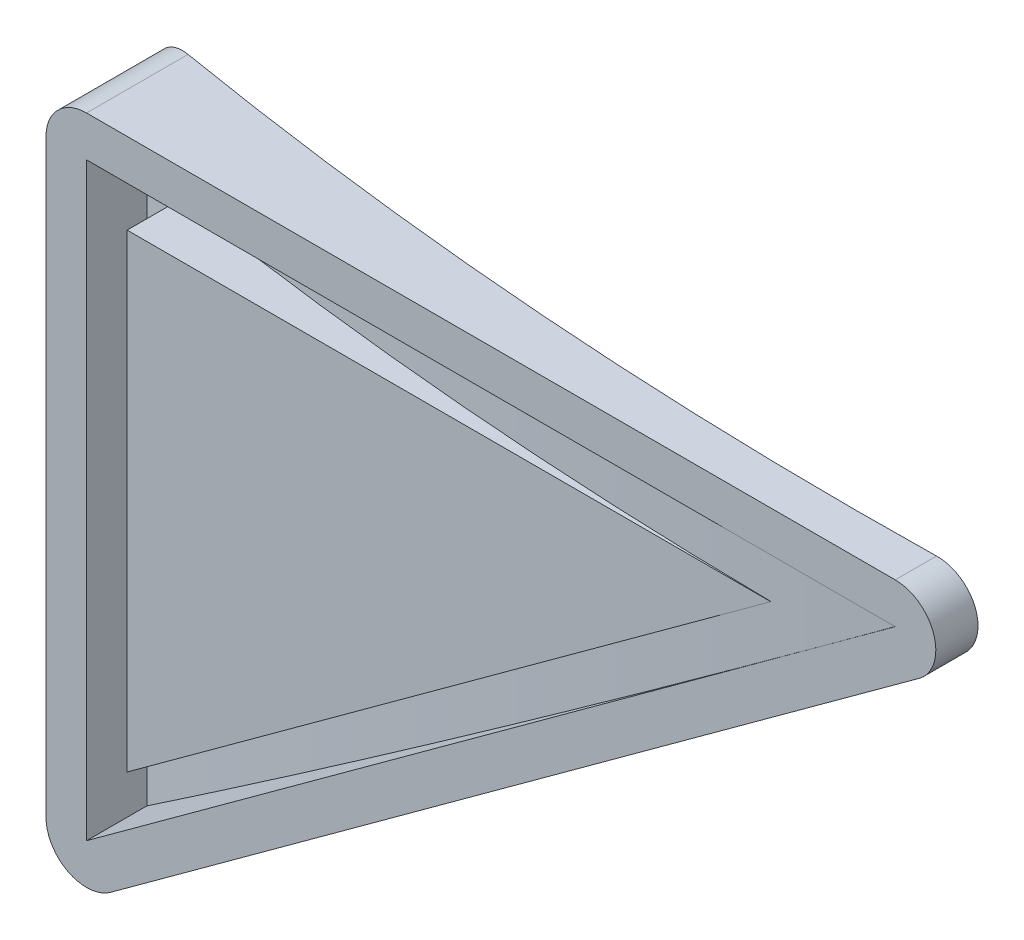
ISO-10303-21;
HEADER;
FILE_DESCRIPTION(('STEP AP214'),'2;1');
FILE_NAME('part.step','',(''),(''),'','','');
FILE_SCHEMA(('AUTOMOTIVE_DESIGN { 1 0 10303 214 1 1 1 1 }'));
ENDSEC;
DATA;
#1=APPLICATION_CONTEXT('core data for automotive mechanical design processes');
#2=APPLICATION_PROTOCOL_DEFINITION('international standard','automotive_design',2000,#1);
#3=PRODUCT_CONTEXT('',#1,'mechanical');
#4=PRODUCT('Part','Part','',(#3));
#5=PRODUCT_RELATED_PRODUCT_CATEGORY('part','',(#4));
#6=PRODUCT_DEFINITION_FORMATION('','',#4);
#7=PRODUCT_DEFINITION_CONTEXT('part definition',#1,'design');
#8=PRODUCT_DEFINITION('design','',#6,#7);
#9=PRODUCT_DEFINITION_SHAPE('','',#8);
#10=(LENGTH_UNIT() NAMED_UNIT(*) SI_UNIT(.MILLI.,.METRE.));
#11=(NAMED_UNIT(*) PLANE_ANGLE_UNIT() SI_UNIT($,.RADIAN.));
#12=(NAMED_UNIT(*) SI_UNIT($,.STERADIAN.) SOLID_ANGLE_UNIT());
#13=UNCERTAINTY_MEASURE_WITH_UNIT(LENGTH_MEASURE(1.E-05),#10,'distance_accuracy_value','');
#14=(GEOMETRIC_REPRESENTATION_CONTEXT(3) GLOBAL_UNCERTAINTY_ASSIGNED_CONTEXT((#13)) GLOBAL_UNIT_ASSIGNED_CONTEXT((#10,
#11,#12)) REPRESENTATION_CONTEXT('',''));
#15=CARTESIAN_POINT('',(0.,0.,0.));
#16=DIRECTION('',(0.,0.,1.));
#17=DIRECTION('',(1.,0.,0.));
#18=AXIS2_PLACEMENT_3D('',#15,#16,#17);
#19=CARTESIAN_POINT('',(0.,175.,0.));
#20=DIRECTION('',(0.,-1.,0.));
#21=DIRECTION('',(0.,0.,-1.));
#22=AXIS2_PLACEMENT_3D('',#19,#20,#21);
#23=CYLINDRICAL_SURFACE('',#22,1097.);
#24=DIRECTION('',(0.,-1.,0.));
#25=VECTOR('',#24,1.);
#26=CARTESIAN_POINT('',(-170.,175.,1083.74766435734));
#27=LINE('',#26,#25);
#28=CARTESIAN_POINT('',(-170.,155.,1083.74766435734));
#29=VERTEX_POINT('',#28);
#30=CARTESIAN_POINT('',(-170.,39.3355779004651,1083.74766435734));
#31=VERTEX_POINT('',#30);
#32=EDGE_CURVE('E57',#29,#31,#27,.T.);
#33=ORIENTED_EDGE('',*,*,#32,.F.);
#34=CARTESIAN_POINT('',(0.,155.,0.));
#35=DIRECTION('',(0.,1.,0.));
#36=DIRECTION('',(0.,0.,1.));
#37=AXIS2_PLACEMENT_3D('',#34,#35,#36);
#38=CIRCLE('',#37,1097.);
#39=CARTESIAN_POINT('',(-11.3745068349236,155.,1096.94102876785));
#40=VERTEX_POINT('',#39);
#41=EDGE_CURVE('E170',#40,#29,#38,.F.);
#42=ORIENTED_EDGE('',*,*,#41,.F.);
#43=CARTESIAN_POINT('',(0.,163.293911233798,0.));
#44=DIRECTION('',(0.589172157449442,-0.808007530216378,0.));
#45=DIRECTION('',(-0.808007530216378,-0.589172157449442,0.));
#46=AXIS2_PLACEMENT_3D('',#43,#44,#45);
#47=ELLIPSE('',#46,1357.66061450718,1097.);
#48=EDGE_CURVE('E144',#31,#40,#47,.F.);
#49=ORIENTED_EDGE('',*,*,#48,.F.);
#50=EDGE_LOOP('',(#33,#42,#49));
#51=FACE_BOUND('',#50,.T.);
#52=CARTESIAN_POINT('',(0.,165.,0.));
#53=DIRECTION('',(0.,1.,0.));
#54=DIRECTION('',(0.,0.,1.));
#55=AXIS2_PLACEMENT_3D('',#52,#53,#54);
#56=CIRCLE('',#55,1097.);
#57=CARTESIAN_POINT('',(19.3127465825383,165.,1096.82998583164));
#58=VERTEX_POINT('',#57);
#59=CARTESIAN_POINT('',(0.,165.,1097.));
#60=VERTEX_POINT('',#59);
#61=EDGE_CURVE('E184',#58,#60,#56,.F.);
#62=ORIENTED_EDGE('',*,*,#61,.T.);
#63=CARTESIAN_POINT('',(0.,165.,0.));
#64=DIRECTION('',(0.,1.,0.));
#65=DIRECTION('',(0.,0.,1.));
#66=AXIS2_PLACEMENT_3D('',#63,#64,#65);
#67=CIRCLE('',#66,1097.);
#68=CARTESIAN_POINT('',(-180.,165.,1082.13169254024));
#69=VERTEX_POINT('',#68);
#70=EDGE_CURVE('E65',#60,#69,#67,.F.);
#71=ORIENTED_EDGE('',*,*,#70,.T.);
#72=DIRECTION('',(0.,-1.,0.));
#73=VECTOR('',#72,1.);
#74=CARTESIAN_POINT('',(-180.,175.,1082.13169254024));
#75=LINE('',#74,#73);
#76=CARTESIAN_POINT('',(-180.,19.6677889502324,1082.13169254024));
#77=VERTEX_POINT('',#76);
#78=EDGE_CURVE('E197',#69,#77,#75,.T.);
#79=ORIENTED_EDGE('',*,*,#78,.T.);
#80=CARTESIAN_POINT('',(0.,150.917788950233,0.));
#81=DIRECTION('',(0.589172157449442,-0.808007530216378,0.));
#82=DIRECTION('',(-0.808007530216378,-0.589172157449442,0.));
#83=AXIS2_PLACEMENT_3D('',#80,#81,#82);
#84=ELLIPSE('',#83,1357.66061450719,1097.);
#85=CARTESIAN_POINT('',(0.,150.917788950233,1097.));
#86=VERTEX_POINT('',#85);
#87=EDGE_CURVE('E200',#77,#86,#84,.F.);
#88=ORIENTED_EDGE('',*,*,#87,.T.);
#89=CARTESIAN_POINT('',(0.,150.917788950233,0.));
#90=DIRECTION('',(0.589172157449442,-0.808007530216378,0.));
#91=DIRECTION('',(-0.808007530216378,-0.589172157449442,0.));
#92=AXIS2_PLACEMENT_3D('',#89,#90,#91);
#93=ELLIPSE('',#92,1357.66061450719,1097.);
#94=EDGE_CURVE('E180',#86,#58,#93,.F.);
#95=ORIENTED_EDGE('',*,*,#94,.T.);
#96=EDGE_LOOP('',(#62,#71,#79,#88,#95));
#97=FACE_BOUND('',#96,.T.);
#98=ADVANCED_FACE('F40',(#51,#97),#23,.T.);
#99=CARTESIAN_POINT('',(0.,175.,0.));
#100=DIRECTION('',(0.,-1.,0.));
#101=DIRECTION('',(0.,0.,-1.));
#102=AXIS2_PLACEMENT_3D('',#99,#100,#101);
#103=CYLINDRICAL_SURFACE('',#102,1087.);
#104=CARTESIAN_POINT('',(0.,138.541666666667,0.));
#105=DIRECTION('',(-0.589172157449442,0.808007530216377,0.));
#106=DIRECTION('',(-0.808007530216378,-0.589172157449442,0.));
#107=AXIS2_PLACEMENT_3D('',#104,#105,#106);
#108=ELLIPSE('',#107,1345.28449222362,1087.);
#109=CARTESIAN_POINT('',(25.2044681570327,156.919924697836,1086.70775040253));
#110=VERTEX_POINT('',#109);
#111=CARTESIAN_POINT('',(-174.108278425506,11.5877136480688,1072.96565992752));
#112=VERTEX_POINT('',#111);
#113=EDGE_CURVE('E204',#110,#112,#108,.F.);
#114=ORIENTED_EDGE('',*,*,#113,.T.);
#115=CARTESIAN_POINT('',(-174.108278425505,11.5877136480688,1072.96565992752));
#116=CARTESIAN_POINT('',(-174.338273746473,11.4199715353943,1072.92833964947));
#117=CARTESIAN_POINT('',(-174.575326334058,11.2621996459547,1072.88979701747));
#118=CARTESIAN_POINT('',(-175.061709157857,10.967561505856,1072.81054166278));
#119=CARTESIAN_POINT('',(-175.31103812756,10.8306931046086,1072.76982916393));
#120=CARTESIAN_POINT('',(-175.819932342061,10.5789171737396,1072.68654223683));
#121=CARTESIAN_POINT('',(-176.079487184804,10.4639879889427,1072.6439696961));
#122=CARTESIAN_POINT('',(-176.607186332997,10.2566696655293,1072.55721208685));
#123=CARTESIAN_POINT('',(-176.875330669272,10.1642806078132,1072.51302701253));
#124=CARTESIAN_POINT('',(-177.418338999365,10.0026303031811,1072.42333466181));
#125=CARTESIAN_POINT('',(-177.693204193145,9.9333732191569,1072.37782714901));
#126=CARTESIAN_POINT('',(-178.247663848457,9.81844999165931,1072.28580579155));
#127=CARTESIAN_POINT('',(-178.527258434578,9.77278447067994,1072.23929192036));
#128=CARTESIAN_POINT('',(-179.089176978252,9.70533589213078,1072.14558144606));
#129=CARTESIAN_POINT('',(-179.371500722173,9.6835509802738,1072.09838489623));
#130=CARTESIAN_POINT('',(-179.93691805033,9.66398761150045,1072.00363231265));
#131=CARTESIAN_POINT('',(-180.22001163557,9.66620918592908,1071.95607627844));
#132=CARTESIAN_POINT('',(-180.786736922285,9.69472327609535,1071.86064338274));
#133=CARTESIAN_POINT('',(-181.070361119588,9.72116460911046,1071.81276635642));
#134=CARTESIAN_POINT('',(-181.634368040197,9.79814623188512,1071.71733127345));
#135=CARTESIAN_POINT('',(-181.914750829772,9.84868602807346,1071.66977321027));
#136=CARTESIAN_POINT('',(-182.470331605161,9.97353613739706,1071.57531583085));
#137=CARTESIAN_POINT('',(-182.745528826125,10.0478499284895,1071.52841661203));
#138=CARTESIAN_POINT('',(-183.288731810457,10.2197522385687,1071.43563349246));
#139=CARTESIAN_POINT('',(-183.556737587024,10.3173407148381,1071.38974958984));
#140=CARTESIAN_POINT('',(-184.083745140951,10.5351902588334,1071.29932618843));
#141=CARTESIAN_POINT('',(-184.342743007426,10.6554610323139,1071.25478727467));
#142=CARTESIAN_POINT('',(-184.849733582945,10.9178429671142,1071.16742023464));
#143=CARTESIAN_POINT('',(-185.097726265614,11.0599541807737,1071.12459211249));
#144=CARTESIAN_POINT('',(-185.580862504098,11.3650429523676,1071.04099061634));
#145=CARTESIAN_POINT('',(-185.81600719561,11.5280186617156,1071.00021706076));
#146=CARTESIAN_POINT('',(-186.271719525166,11.8737316156122,1070.92105217949));
#147=CARTESIAN_POINT('',(-186.492287301752,12.0564686722996,1070.88266083118));
#148=CARTESIAN_POINT('',(-186.91532575538,12.4387615790981,1070.80890298334));
#149=CARTESIAN_POINT('',(-187.117937608419,12.6381566764303,1070.77351300307));
#150=CARTESIAN_POINT('',(-187.505678604165,13.053746907084,1070.70568282766));
#151=CARTESIAN_POINT('',(-187.690807628952,13.2699421537024,1070.67324265241));
#152=CARTESIAN_POINT('',(-188.042189484985,13.7176479829785,1070.61158540756));
#153=CARTESIAN_POINT('',(-188.208439547946,13.9491608038473,1070.58236881067));
#154=CARTESIAN_POINT('',(-188.520734958871,14.4258185581858,1070.52742031165));
#155=CARTESIAN_POINT('',(-188.6667810035,14.6709630212074,1070.50168828938));
#156=CARTESIAN_POINT('',(-188.935642716397,15.16963226785,1070.45426866168));
#157=CARTESIAN_POINT('',(-189.058752530737,15.4229936272935,1070.43252990408));
#158=CARTESIAN_POINT('',(-189.283249234619,15.9394436598426,1070.39285524535));
#159=CARTESIAN_POINT('',(-189.38463693855,16.2025319678395,1070.37491920165));
#160=CARTESIAN_POINT('',(-189.564812588519,16.7362996745688,1070.34302455193));
#161=CARTESIAN_POINT('',(-189.643621267624,17.0069718570544,1070.32906229708));
#162=CARTESIAN_POINT('',(-189.778114732121,17.5540724782283,1070.3052236684));
#163=CARTESIAN_POINT('',(-189.833808540342,17.8304986265385,1070.29534570028));
#164=CARTESIAN_POINT('',(-189.91843198205,18.3666994980187,1070.2803328999));
#165=CARTESIAN_POINT('',(-189.949028242396,18.6262043491936,1070.27490275161));
#166=CARTESIAN_POINT('',(-189.989806076038,19.14640017008,1070.26766449157));
#167=CARTESIAN_POINT('',(-190.000023684464,19.4070882276713,1070.26584998638));
#168=CARTESIAN_POINT('',(-190.,19.6677889502326,1070.265854823));
#169=B_SPLINE_CURVE_WITH_KNOTS('',3,(#115,#116,#117,#118,#119,#120,#121,#122,#123,#124,#125,
#126,#127,#128,#129,#130,#131,#132,#133,#134,#135,#136,#137,#138,#139,#140,#141,#142,#143,#144,
#145,#146,#147,#148,#149,#150,#151,#152,#153,#154,#155,#156,#157,#158,#159,#160,#161,#162,#163,
#164,#165,#166,#167,#168),.UNSPECIFIED.,.F.,.F.,(4,2,2,2,2,2,2,2,2,2,2,2,2,2,2,2,2,2,2,2,2,2,2,
2,2,2,4),(0.,0.861031072831286,1.72197350147786,2.58206168954562,3.44215296456916,
4.30239894061912,5.16266761421727,6.0228694847376,6.8830724784139,7.74859666801091,
8.61410313118814,9.47973626941707,10.3453678189161,11.2113706160212,12.0773754885047,
12.9433036863191,13.8092236529093,14.6675842337775,15.5259506037615,16.3844426768274,
17.2429051404292,18.0894590898157,18.9359812953204,19.7817236767181,20.6271356135766,
21.4103946685647,22.1922674712198),.UNSPECIFIED.);
#170=CARTESIAN_POINT('',(-190.,19.6677889502326,1070.265854823));
#171=VERTEX_POINT('',#170);
#172=EDGE_CURVE('E288',#112,#171,#169,.T.);
#173=ORIENTED_EDGE('',*,*,#172,.T.);
#174=DIRECTION('',(0.,-1.,0.));
#175=VECTOR('',#174,1.);
#176=CARTESIAN_POINT('',(-190.,175.,1070.265854823));
#177=LINE('',#176,#175);
#178=CARTESIAN_POINT('',(-190.,165.,1070.265854823));
#179=VERTEX_POINT('',#178);
#180=EDGE_CURVE('E247',#171,#179,#177,.F.);
#181=ORIENTED_EDGE('',*,*,#180,.T.);
#182=CARTESIAN_POINT('',(-190.,165.,1070.265854823));
#183=CARTESIAN_POINT('',(-190.000032451494,165.27816778552,1070.26584823925));
#184=CARTESIAN_POINT('',(-189.988394792284,165.556329549505,1070.26791502348));
#185=CARTESIAN_POINT('',(-189.942014655616,166.110637537032,1070.27614758697));
#186=CARTESIAN_POINT('',(-189.907274032663,166.386783920551,1070.28231303722));
#187=CARTESIAN_POINT('',(-189.814978647041,166.934774333611,1070.29868538825));
#188=CARTESIAN_POINT('',(-189.757451279054,167.20662312319,1070.30888743613));
#189=CARTESIAN_POINT('',(-189.620038571035,167.744425968653,1070.33324057011));
#190=CARTESIAN_POINT('',(-189.540153364401,168.010380059699,1070.34739163265));
#191=CARTESIAN_POINT('',(-189.358609268536,168.53460053257,1070.37952408435));
#192=CARTESIAN_POINT('',(-189.256943796647,168.792864563289,1070.39750663148));
#193=CARTESIAN_POINT('',(-189.032625906311,169.299825970811,1070.43714402559));
#194=CARTESIAN_POINT('',(-188.909972874059,169.548523067558,1070.45879897996));
#195=CARTESIAN_POINT('',(-188.644615393255,170.034609550072,1070.50559420478));
#196=CARTESIAN_POINT('',(-188.501912438082,170.271999776248,1070.53073421564));
#197=CARTESIAN_POINT('',(-188.197509066875,170.73387689941,1070.58428974684));
#198=CARTESIAN_POINT('',(-188.035808633859,170.958363784862,1070.6127052701));
#199=CARTESIAN_POINT('',(-187.693412073324,171.394434262396,1070.6727854359));
#200=CARTESIAN_POINT('',(-187.512592192599,171.605917769624,1070.70447120951));
#201=CARTESIAN_POINT('',(-187.134212102499,172.012860587524,1070.77066804182));
#202=CARTESIAN_POINT('',(-186.936651676775,172.208319691036,1070.80517913703));
#203=CARTESIAN_POINT('',(-186.526172313728,172.581959894016,1070.87675782212));
#204=CARTESIAN_POINT('',(-186.313250185255,172.760137385378,1070.91382594311));
#205=CARTESIAN_POINT('',(-185.873598199561,173.098006467087,1070.99022183526));
#206=CARTESIAN_POINT('',(-185.646868395528,173.257698128635,1071.02954959773));
#207=CARTESIAN_POINT('',(-185.177781609363,173.559762099156,1071.1107536878));
#208=CARTESIAN_POINT('',(-184.935244763251,173.701847415619,1071.15265884708));
#209=CARTESIAN_POINT('',(-184.439317758427,173.965002261875,1071.23816277299));
#210=CARTESIAN_POINT('',(-184.185927577505,174.086071748656,1071.28176154307));
#211=CARTESIAN_POINT('',(-183.670137835811,174.306378774386,1071.37031360573));
#212=CARTESIAN_POINT('',(-183.407741034021,174.405622931253,1071.41526648298));
#213=CARTESIAN_POINT('',(-182.875804783188,174.581663655866,1071.50618892866));
#214=CARTESIAN_POINT('',(-182.606266804243,174.658464805211,1071.5521582875));
#215=CARTESIAN_POINT('',(-181.951828520836,174.815528226336,1071.66351151673));
#216=CARTESIAN_POINT('',(-181.564238457272,174.884697301948,1071.72924912045));
#217=CARTESIAN_POINT('',(-180.979369546464,174.953864196303,1071.82811449738));
#218=CARTESIAN_POINT('',(-180.783937674196,174.97115535616,1071.86109514146));
#219=CARTESIAN_POINT('',(-180.392358606724,174.994222853288,1071.92706673574));
#220=CARTESIAN_POINT('',(-180.196211281919,174.999996988719,1071.96005768669));
#221=CARTESIAN_POINT('',(-180.,175.,1071.99300370851));
#222=B_SPLINE_CURVE_WITH_KNOTS('',3,(#182,#183,#184,#185,#186,#187,#188,#189,#190,#191,#192,
#193,#194,#195,#196,#197,#198,#199,#200,#201,#202,#203,#204,#205,#206,#207,#208,#209,#210,#211,
#212,#213,#214,#215,#216,#217,#218,#219,#220,#221),.UNSPECIFIED.,.F.,.F.,(4,2,2,2,2,2,2,2,2,2,2,
2,2,2,2,2,2,2,2,4),(0.,0.834243540835427,1.6684201239908,2.50159687237801,3.33476864966504,
4.16819259290706,5.00164091475818,5.83502719172971,6.6684142136515,7.50757057407448,
8.34673778120509,9.18607981677321,10.0254186193865,10.8770152081542,11.7286135398079,
12.57995329108,13.4311191250751,14.625520721045,15.222086065958,15.8187654520605),.UNSPECIFIED.);
#223=CARTESIAN_POINT('',(-180.,175.,1071.99300370851));
#224=VERTEX_POINT('',#223);
#225=EDGE_CURVE('E270',#179,#224,#222,.T.);
#226=ORIENTED_EDGE('',*,*,#225,.T.);
#227=CARTESIAN_POINT('',(0.,175.,0.));
#228=DIRECTION('',(0.,-1.,0.));
#229=DIRECTION('',(0.,0.,1.));
#230=AXIS2_PLACEMENT_3D('',#227,#228,#229);
#231=CIRCLE('',#230,1087.);
#232=CARTESIAN_POINT('',(19.3127465825383,175.,1086.82842151806));
#233=VERTEX_POINT('',#232);
#234=EDGE_CURVE('E251',#233,#224,#231,.T.);
#235=ORIENTED_EDGE('',*,*,#234,.F.);
#236=CARTESIAN_POINT('',(19.3127465825383,175.,1086.82842151806));
#237=CARTESIAN_POINT('',(19.5940551236681,175.000030217501,1086.82342381698));
#238=CARTESIAN_POINT('',(19.8753572543408,174.988131095735,1086.81831481164));
#239=CARTESIAN_POINT('',(20.4359448263409,174.94069346358,1086.80791776024));
#240=CARTESIAN_POINT('',(20.7152303646,174.905156097162,1086.80262972287));
#241=CARTESIAN_POINT('',(21.2696143515344,174.810694306367,1086.79192143316));
#242=CARTESIAN_POINT('',(21.5447155948773,174.751786273769,1086.78650127598));
#243=CARTESIAN_POINT('',(22.0889744291417,174.611012186742,1086.7755753841));
#244=CARTESIAN_POINT('',(22.3581320911888,174.529146407205,1086.77006965042));
#245=CARTESIAN_POINT('',(22.8887195656584,174.342992097574,1086.75902433824));
#246=CARTESIAN_POINT('',(23.1501457006805,174.238693086482,1086.75348474509));
#247=CARTESIAN_POINT('',(23.6632800591622,174.008437094003,1086.74243270418));
#248=CARTESIAN_POINT('',(23.9149882816506,173.882480110451,1086.73692025642));
#249=CARTESIAN_POINT('',(24.4068492826489,173.609829779744,1086.72598488276));
#250=CARTESIAN_POINT('',(24.6470043059727,173.463140482917,1086.72056193962));
#251=CARTESIAN_POINT('',(25.1141034669431,173.150049677485,1086.70986762403));
#252=CARTESIAN_POINT('',(25.3410476645728,172.983648258392,1086.7045962509));
#253=CARTESIAN_POINT('',(25.7801211942697,172.632307970938,1086.69426868266));
#254=CARTESIAN_POINT('',(25.9922499744387,172.447368412625,1086.68921249558));
#255=CARTESIAN_POINT('',(26.4001752010033,172.060270369133,1086.67937883546));
#256=CARTESIAN_POINT('',(26.5959716181306,171.858111853099,1086.67460136293));
#257=CARTESIAN_POINT('',(26.9698675796214,171.437980069935,1086.6653860461));
#258=CARTESIAN_POINT('',(27.1479643997683,171.220004377226,1086.66094825412));
#259=CARTESIAN_POINT('',(27.4851590098312,170.769815219191,1086.65247180902));
#260=CARTESIAN_POINT('',(27.6442568115217,170.53760176269,1086.64843315566));
#261=CARTESIAN_POINT('',(27.9422849289066,170.060644848379,1086.64081045121));
#262=CARTESIAN_POINT('',(28.0812200373145,169.815904387036,1086.63722629211));
#263=CARTESIAN_POINT('',(28.3379784492953,169.315582399377,1086.63056071485));
#264=CARTESIAN_POINT('',(28.4558017537346,169.060000873506,1086.62747929666));
#265=CARTESIAN_POINT('',(28.6694899150372,168.539831711691,1086.62186236946));
#266=CARTESIAN_POINT('',(28.7653562485197,168.275244682748,1086.61932682375));
#267=CARTESIAN_POINT('',(28.9344574186204,167.738930022443,1086.61483715923));
#268=CARTESIAN_POINT('',(29.0076922629846,167.467202393526,1086.61288304022));
#269=CARTESIAN_POINT('',(29.1309906992693,166.918618390071,1086.60958452803));
#270=CARTESIAN_POINT('',(29.1810609409738,166.641763511159,1086.60823995987));
#271=CARTESIAN_POINT('',(29.2577043973498,166.084817826127,1086.60617898404));
#272=CARTESIAN_POINT('',(29.2842776087951,165.804727019561,1086.60546257646));
#273=CARTESIAN_POINT('',(29.3137375526866,165.243302132281,1086.60466822541));
#274=CARTESIAN_POINT('',(29.3166243304552,164.961968053945,1086.60459028071));
#275=CARTESIAN_POINT('',(29.2986909588696,164.40005746309,1086.60507397479));
#276=CARTESIAN_POINT('',(29.2778708455572,164.11948094942,1086.60563561259));
#277=CARTESIAN_POINT('',(29.2126820941939,163.561165658815,1086.60739012069));
#278=CARTESIAN_POINT('',(29.1683206245673,163.283426044261,1086.60858279884));
#279=CARTESIAN_POINT('',(29.0563683401146,162.732665823168,1086.61158220861));
#280=CARTESIAN_POINT('',(28.9887770270284,162.459645317981,1086.6133889534));
#281=CARTESIAN_POINT('',(28.8308312311511,161.920217157395,1086.61759115453));
#282=CARTESIAN_POINT('',(28.7404723327271,161.653810795791,1086.61998672506));
#283=CARTESIAN_POINT('',(28.5376438080593,161.129565608228,1086.62533247187));
#284=CARTESIAN_POINT('',(28.4251747134341,160.87172657645,1086.62828263482));
#285=CARTESIAN_POINT('',(28.1788552157075,160.366297855862,1086.6346981836));
#286=CARTESIAN_POINT('',(28.044992719591,160.118714064283,1086.63816386076));
#287=CARTESIAN_POINT('',(27.7568885229319,159.635716521916,1086.64556130027));
#288=CARTESIAN_POINT('',(27.6026472872857,159.400302493672,1086.64949305199));
#289=CARTESIAN_POINT('',(27.275028096173,158.943515747266,1086.65776565481));
#290=CARTESIAN_POINT('',(27.1016671583264,158.722130814432,1086.66210614163));
#291=CARTESIAN_POINT('',(26.7369944358734,158.294822302846,1086.67113993863));
#292=CARTESIAN_POINT('',(26.5456897046541,158.088892705702,1086.67583311002));
#293=CARTESIAN_POINT('',(26.1681363536628,157.715339966412,1086.68498668513));
#294=CARTESIAN_POINT('',(25.9835956313338,157.545985600864,1086.68941700015));
#295=CARTESIAN_POINT('',(25.6026931490396,157.221884643195,1086.69845791087));
#296=CARTESIAN_POINT('',(25.4063537080588,157.06711180936,1086.70306816074));
#297=CARTESIAN_POINT('',(25.2044681570327,156.919924697836,1086.70775040253));
#298=B_SPLINE_CURVE_WITH_KNOTS('',3,(#236,#237,#238,#239,#240,#241,#242,#243,#244,#245,#246,
#247,#248,#249,#250,#251,#252,#253,#254,#255,#256,#257,#258,#259,#260,#261,#262,#263,#264,#265,
#266,#267,#268,#269,#270,#271,#272,#273,#274,#275,#276,#277,#278,#279,#280,#281,#282,#283,#284,
#285,#286,#287,#288,#289,#290,#291,#292,#293,#294,#295,#296,#297),.UNSPECIFIED.,.F.,.F.,(4,2,2,
2,2,2,2,2,2,2,2,2,2,2,2,2,2,2,2,2,2,2,2,2,2,2,2,2,2,2,4),(0.,0.84380100673661,1.68756118075906,
2.53073059933882,3.37388992239928,4.21744403576942,5.06099823344552,5.90438785900857,
6.74777365490274,7.59119085153467,8.43460955956842,9.27815788119508,10.1217056800387,
10.9650526362597,11.8083995578697,12.6516897472404,13.4949796479855,14.3380273179189,
15.1810751036048,16.0241212761759,16.8671661670592,17.7099544950404,18.5527609012292,
19.3957308905122,20.238680613865,21.0821085265215,21.9255172015391,22.7681811625088,
23.6105152643641,24.3613545557238,25.110815697121),.UNSPECIFIED.);
#299=EDGE_CURVE('E262',#233,#110,#298,.T.);
#300=ORIENTED_EDGE('',*,*,#299,.T.);
#301=EDGE_LOOP('',(#114,#173,#181,#226,#235,#300));
#302=FACE_BOUND('',#301,.T.);
#303=ADVANCED_FACE('F276',(#302),#103,.F.);
#304=CARTESIAN_POINT('',(0.,175.,0.));
#305=DIRECTION('',(0.,1.,0.));
#306=DIRECTION('',(0.,0.,1.));
#307=AXIS2_PLACEMENT_3D('',#304,#305,#306);
#308=PLANE('',#307);
#309=ORIENTED_EDGE('',*,*,#234,.T.);
#310=DIRECTION('',(0.,0.,-1.));
#311=VECTOR('',#310,1.);
#312=CARTESIAN_POINT('',(-180.,175.,1080.4207513742));
#313=LINE('',#312,#311);
#314=CARTESIAN_POINT('',(-180.,175.,1097.));
#315=VERTEX_POINT('',#314);
#316=EDGE_CURVE('E12',#224,#315,#313,.F.);
#317=ORIENTED_EDGE('',*,*,#316,.T.);
#318=DIRECTION('',(-1.,0.,0.));
#319=VECTOR('',#318,1.);
#320=CARTESIAN_POINT('',(19.3127465825383,175.,1097.));
#321=LINE('',#320,#319);
#322=CARTESIAN_POINT('',(19.3127465825383,175.,1097.));
#323=VERTEX_POINT('',#322);
#324=EDGE_CURVE('E220',#323,#315,#321,.T.);
#325=ORIENTED_EDGE('',*,*,#324,.F.);
#326=DIRECTION('',(0.,0.,-1.));
#327=VECTOR('',#326,1.);
#328=CARTESIAN_POINT('',(19.3127465825383,175.,1085.8494370768));
#329=LINE('',#328,#327);
#330=EDGE_CURVE('E50',#323,#233,#329,.T.);
#331=ORIENTED_EDGE('',*,*,#330,.T.);
#332=EDGE_LOOP('',(#309,#317,#325,#331));
#333=FACE_BOUND('',#332,.T.);
#334=ADVANCED_FACE('F281',(#333),#308,.T.);
#335=CARTESIAN_POINT('',(-190.,0.,1067.85519305855));
#336=DIRECTION('',(1.,0.,0.));
#337=DIRECTION('',(0.,0.,-1.));
#338=AXIS2_PLACEMENT_3D('',#335,#336,#337);
#339=PLANE('',#338);
#340=ORIENTED_EDGE('',*,*,#180,.F.);
#341=DIRECTION('',(0.,0.,-1.));
#342=VECTOR('',#341,1.);
#343=CARTESIAN_POINT('',(-190.,19.6677889502326,1067.85519305855));
#344=LINE('',#343,#342);
#345=CARTESIAN_POINT('',(-190.,19.6677889502326,1097.));
#346=VERTEX_POINT('',#345);
#347=EDGE_CURVE('E299',#171,#346,#344,.F.);
#348=ORIENTED_EDGE('',*,*,#347,.T.);
#349=DIRECTION('',(0.,-1.,0.));
#350=VECTOR('',#349,1.);
#351=CARTESIAN_POINT('',(-190.,165.,1097.));
#352=LINE('',#351,#350);
#353=CARTESIAN_POINT('',(-190.,165.,1097.));
#354=VERTEX_POINT('',#353);
#355=EDGE_CURVE('E230',#354,#346,#352,.T.);
#356=ORIENTED_EDGE('',*,*,#355,.F.);
#357=DIRECTION('',(0.,0.,-1.));
#358=VECTOR('',#357,1.);
#359=CARTESIAN_POINT('',(-190.,165.,1070.265854823));
#360=LINE('',#359,#358);
#361=EDGE_CURVE('E295',#354,#179,#360,.T.);
#362=ORIENTED_EDGE('',*,*,#361,.T.);
#363=EDGE_LOOP('',(#340,#348,#356,#362));
#364=FACE_BOUND('',#363,.T.);
#365=ADVANCED_FACE('F319',(#364),#339,.F.);
#366=CARTESIAN_POINT('',(-190.,0.,1067.85519305855));
#367=DIRECTION('',(-0.589172157449442,0.808007530216377,0.));
#368=DIRECTION('',(-0.808007530216378,-0.589172157449442,0.));
#369=AXIS2_PLACEMENT_3D('',#366,#367,#368);
#370=PLANE('',#369);
#371=DIRECTION('',(0.,0.,-1.));
#372=VECTOR('',#371,1.);
#373=CARTESIAN_POINT('',(25.2044681570327,156.919924697836,1095.85993630573));
#374=LINE('',#373,#372);
#375=CARTESIAN_POINT('',(25.2044681570328,156.919924697836,1097.));
#376=VERTEX_POINT('',#375);
#377=EDGE_CURVE('E255',#110,#376,#374,.F.);
#378=ORIENTED_EDGE('',*,*,#377,.T.);
#379=DIRECTION('',(0.808007530216378,0.589172157449442,0.));
#380=VECTOR('',#379,1.);
#381=CARTESIAN_POINT('',(-174.108278425505,11.5877136480689,1097.));
#382=LINE('',#381,#380);
#383=CARTESIAN_POINT('',(-174.108278425505,11.5877136480689,1097.));
#384=VERTEX_POINT('',#383);
#385=EDGE_CURVE('E238',#384,#376,#382,.T.);
#386=ORIENTED_EDGE('',*,*,#385,.F.);
#387=DIRECTION('',(0.,0.,-1.));
#388=VECTOR('',#387,1.);
#389=CARTESIAN_POINT('',(-174.108278425505,11.5877136480688,1067.85519305855));
#390=LINE('',#389,#388);
#391=EDGE_CURVE('E258',#384,#112,#390,.T.);
#392=ORIENTED_EDGE('',*,*,#391,.T.);
#393=ORIENTED_EDGE('',*,*,#113,.F.);
#394=EDGE_LOOP('',(#378,#386,#392,#393));
#395=FACE_BOUND('',#394,.T.);
#396=ADVANCED_FACE('F327',(#395),#370,.F.);
#397=CARTESIAN_POINT('',(-180.,19.6677889502326,1067.85519305855));
#398=DIRECTION('',(0.,0.,-1.));
#399=DIRECTION('',(-1.,0.,0.));
#400=AXIS2_PLACEMENT_3D('',#397,#398,#399);
#401=CYLINDRICAL_SURFACE('',#400,10.);
#402=ORIENTED_EDGE('',*,*,#391,.F.);
#403=CARTESIAN_POINT('',(-180.,19.6677889502326,1097.));
#404=DIRECTION('',(0.,0.,1.));
#405=DIRECTION('',(1.,0.,0.));
#406=AXIS2_PLACEMENT_3D('',#403,#404,#405);
#407=CIRCLE('',#406,10.);
#408=EDGE_CURVE('E234',#346,#384,#407,.T.);
#409=ORIENTED_EDGE('',*,*,#408,.F.);
#410=ORIENTED_EDGE('',*,*,#347,.F.);
#411=ORIENTED_EDGE('',*,*,#172,.F.);
#412=EDGE_LOOP('',(#402,#409,#410,#411));
#413=FACE_BOUND('',#412,.T.);
#414=ADVANCED_FACE('F284',(#413),#401,.T.);
#415=CARTESIAN_POINT('',(-180.,165.,1067.85519305855));
#416=DIRECTION('',(0.,0.,1.));
#417=DIRECTION('',(1.,0.,0.));
#418=AXIS2_PLACEMENT_3D('',#415,#416,#417);
#419=CYLINDRICAL_SURFACE('',#418,10.);
#420=ORIENTED_EDGE('',*,*,#361,.F.);
#421=CARTESIAN_POINT('',(-180.,165.,1097.));
#422=DIRECTION('',(0.,0.,1.));
#423=DIRECTION('',(1.,0.,0.));
#424=AXIS2_PLACEMENT_3D('',#421,#422,#423);
#425=CIRCLE('',#424,10.);
#426=EDGE_CURVE('E226',#315,#354,#425,.T.);
#427=ORIENTED_EDGE('',*,*,#426,.F.);
#428=ORIENTED_EDGE('',*,*,#316,.F.);
#429=ORIENTED_EDGE('',*,*,#225,.F.);
#430=EDGE_LOOP('',(#420,#427,#428,#429));
#431=FACE_BOUND('',#430,.T.);
#432=ADVANCED_FACE('F315',(#431),#419,.T.);
#433=CARTESIAN_POINT('',(19.3127465825383,165.,0.));
#434=DIRECTION('',(0.,0.,1.));
#435=DIRECTION('',(1.,0.,0.));
#436=AXIS2_PLACEMENT_3D('',#433,#434,#435);
#437=CYLINDRICAL_SURFACE('',#436,10.);
#438=ORIENTED_EDGE('',*,*,#330,.F.);
#439=CARTESIAN_POINT('',(19.3127465825383,165.,1097.));
#440=DIRECTION('',(0.,0.,1.));
#441=DIRECTION('',(1.,0.,0.));
#442=AXIS2_PLACEMENT_3D('',#439,#440,#441);
#443=CIRCLE('',#442,10.);
#444=EDGE_CURVE('E185',#376,#323,#443,.T.);
#445=ORIENTED_EDGE('',*,*,#444,.F.);
#446=ORIENTED_EDGE('',*,*,#377,.F.);
#447=ORIENTED_EDGE('',*,*,#299,.F.);
#448=EDGE_LOOP('',(#438,#445,#446,#447));
#449=FACE_BOUND('',#448,.T.);
#450=ADVANCED_FACE('F42',(#449),#437,.T.);
#451=CARTESIAN_POINT('',(19.3127465825383,165.,1069.67934628912));
#452=DIRECTION('',(0.,1.,0.));
#453=DIRECTION('',(0.,0.,1.));
#454=AXIS2_PLACEMENT_3D('',#451,#452,#453);
#455=PLANE('',#454);
#456=ORIENTED_EDGE('',*,*,#70,.F.);
#457=DIRECTION('',(-1.,0.,0.));
#458=VECTOR('',#457,1.);
#459=CARTESIAN_POINT('',(19.3127465825383,165.,1097.));
#460=LINE('',#459,#458);
#461=CARTESIAN_POINT('',(-180.,165.,1097.));
#462=VERTEX_POINT('',#461);
#463=EDGE_CURVE('E208',#60,#462,#460,.T.);
#464=ORIENTED_EDGE('',*,*,#463,.T.);
#465=DIRECTION('',(0.,0.,1.));
#466=VECTOR('',#465,1.);
#467=CARTESIAN_POINT('',(-180.,165.,1069.67934628912));
#468=LINE('',#467,#466);
#469=EDGE_CURVE('E216',#69,#462,#468,.T.);
#470=ORIENTED_EDGE('',*,*,#469,.F.);
#471=EDGE_LOOP('',(#456,#464,#470));
#472=FACE_BOUND('',#471,.T.);
#473=ADVANCED_FACE('F349',(#472),#455,.F.);
#474=CARTESIAN_POINT('',(-180.,165.,1069.67934628912));
#475=DIRECTION('',(-1.,0.,0.));
#476=DIRECTION('',(0.,0.,1.));
#477=AXIS2_PLACEMENT_3D('',#474,#475,#476);
#478=PLANE('',#477);
#479=ORIENTED_EDGE('',*,*,#78,.F.);
#480=ORIENTED_EDGE('',*,*,#469,.T.);
#481=DIRECTION('',(0.,-1.,0.));
#482=VECTOR('',#481,1.);
#483=CARTESIAN_POINT('',(-180.,165.,1097.));
#484=LINE('',#483,#482);
#485=CARTESIAN_POINT('',(-180.,19.6677889502326,1097.));
#486=VERTEX_POINT('',#485);
#487=EDGE_CURVE('E212',#462,#486,#484,.T.);
#488=ORIENTED_EDGE('',*,*,#487,.T.);
#489=DIRECTION('',(0.,0.,1.));
#490=VECTOR('',#489,1.);
#491=CARTESIAN_POINT('',(-180.,19.6677889502326,1069.67934628912));
#492=LINE('',#491,#490);
#493=EDGE_CURVE('E217',#77,#486,#492,.T.);
#494=ORIENTED_EDGE('',*,*,#493,.F.);
#495=EDGE_LOOP('',(#479,#480,#488,#494));
#496=FACE_BOUND('',#495,.T.);
#497=ADVANCED_FACE('F351',(#496),#478,.F.);
#498=CARTESIAN_POINT('',(-180.,19.6677889502326,1069.67934628912));
#499=DIRECTION('',(0.589172157449442,-0.808007530216378,0.));
#500=DIRECTION('',(0.808007530216378,0.589172157449442,0.));
#501=AXIS2_PLACEMENT_3D('',#498,#499,#500);
#502=PLANE('',#501);
#503=ORIENTED_EDGE('',*,*,#87,.F.);
#504=ORIENTED_EDGE('',*,*,#493,.T.);
#505=DIRECTION('',(0.808007530216378,0.589172157449442,0.));
#506=VECTOR('',#505,1.);
#507=CARTESIAN_POINT('',(-180.,19.6677889502326,1097.));
#508=LINE('',#507,#506);
#509=EDGE_CURVE('E188',#486,#86,#508,.T.);
#510=ORIENTED_EDGE('',*,*,#509,.T.);
#511=EDGE_LOOP('',(#503,#504,#510));
#512=FACE_BOUND('',#511,.T.);
#513=ADVANCED_FACE('F355',(#512),#502,.F.);
#514=CARTESIAN_POINT('',(19.3127465825383,165.,1097.));
#515=DIRECTION('',(0.,0.,1.));
#516=DIRECTION('',(1.,0.,0.));
#517=AXIS2_PLACEMENT_3D('',#514,#515,#516);
#518=PLANE('',#517);
#519=DIRECTION('',(0.808007530216378,0.589172157449442,0.));
#520=VECTOR('',#519,1.);
#521=CARTESIAN_POINT('',(-180.,19.6677889502326,1097.));
#522=LINE('',#521,#520);
#523=CARTESIAN_POINT('',(19.3127465825383,165.,1097.));
#524=VERTEX_POINT('',#523);
#525=EDGE_CURVE('E189',#86,#524,#522,.T.);
#526=ORIENTED_EDGE('',*,*,#525,.F.);
#527=ORIENTED_EDGE('',*,*,#509,.F.);
#528=ORIENTED_EDGE('',*,*,#487,.F.);
#529=ORIENTED_EDGE('',*,*,#463,.F.);
#530=DIRECTION('',(-1.,0.,0.));
#531=VECTOR('',#530,1.);
#532=CARTESIAN_POINT('',(19.3127465825383,165.,1097.));
#533=LINE('',#532,#531);
#534=EDGE_CURVE('E179',#524,#60,#533,.T.);
#535=ORIENTED_EDGE('',*,*,#534,.F.);
#536=EDGE_LOOP('',(#526,#527,#528,#529,#535));
#537=FACE_BOUND('',#536,.T.);
#538=ORIENTED_EDGE('',*,*,#385,.T.);
#539=ORIENTED_EDGE('',*,*,#444,.T.);
#540=ORIENTED_EDGE('',*,*,#324,.T.);
#541=ORIENTED_EDGE('',*,*,#426,.T.);
#542=ORIENTED_EDGE('',*,*,#355,.T.);
#543=ORIENTED_EDGE('',*,*,#408,.T.);
#544=EDGE_LOOP('',(#538,#539,#540,#541,#542,#543));
#545=FACE_BOUND('',#544,.T.);
#546=ADVANCED_FACE('F323',(#537,#545),#518,.T.);
#547=CARTESIAN_POINT('',(19.3127465825383,165.,1069.67934628912));
#548=DIRECTION('',(0.,1.,0.));
#549=DIRECTION('',(0.,0.,1.));
#550=AXIS2_PLACEMENT_3D('',#547,#548,#549);
#551=PLANE('',#550);
#552=ORIENTED_EDGE('',*,*,#61,.F.);
#553=DIRECTION('',(0.,0.,1.));
#554=VECTOR('',#553,1.);
#555=CARTESIAN_POINT('',(19.3127465825383,165.,1069.67934628912));
#556=LINE('',#555,#554);
#557=EDGE_CURVE('E175',#58,#524,#556,.T.);
#558=ORIENTED_EDGE('',*,*,#557,.T.);
#559=ORIENTED_EDGE('',*,*,#534,.T.);
#560=EDGE_LOOP('',(#552,#558,#559));
#561=FACE_BOUND('',#560,.T.);
#562=ADVANCED_FACE('F358',(#561),#551,.F.);
#563=CARTESIAN_POINT('',(-180.,19.6677889502326,1069.67934628912));
#564=DIRECTION('',(0.589172157449442,-0.808007530216378,0.));
#565=DIRECTION('',(0.808007530216378,0.589172157449442,0.));
#566=AXIS2_PLACEMENT_3D('',#563,#564,#565);
#567=PLANE('',#566);
#568=ORIENTED_EDGE('',*,*,#94,.F.);
#569=ORIENTED_EDGE('',*,*,#525,.T.);
#570=ORIENTED_EDGE('',*,*,#557,.F.);
#571=EDGE_LOOP('',(#568,#569,#570));
#572=FACE_BOUND('',#571,.T.);
#573=ADVANCED_FACE('F357',(#572),#567,.F.);
#574=CARTESIAN_POINT('',(0.,0.,1097.));
#575=DIRECTION('',(0.,0.,-1.));
#576=DIRECTION('',(-1.,0.,0.));
#577=AXIS2_PLACEMENT_3D('',#574,#575,#576);
#578=PLANE('',#577);
#579=DIRECTION('',(0.808007530216378,0.589172157449442,0.));
#580=VECTOR('',#579,1.);
#581=CARTESIAN_POINT('',(-170.,39.3355779004651,1097.));
#582=LINE('',#581,#580);
#583=CARTESIAN_POINT('',(-170.,39.3355779004651,1097.));
#584=VERTEX_POINT('',#583);
#585=CARTESIAN_POINT('',(-11.3745068349236,155.,1097.));
#586=VERTEX_POINT('',#585);
#587=EDGE_CURVE('E141',#584,#586,#582,.T.);
#588=ORIENTED_EDGE('',*,*,#587,.T.);
#589=DIRECTION('',(-1.,0.,0.));
#590=VECTOR('',#589,1.);
#591=CARTESIAN_POINT('',(-11.3745068349236,155.,1097.));
#592=LINE('',#591,#590);
#593=CARTESIAN_POINT('',(-170.,155.,1097.));
#594=VERTEX_POINT('',#593);
#595=EDGE_CURVE('E153',#586,#594,#592,.T.);
#596=ORIENTED_EDGE('',*,*,#595,.T.);
#597=DIRECTION('',(0.,-1.,0.));
#598=VECTOR('',#597,1.);
#599=CARTESIAN_POINT('',(-170.,155.,1097.));
#600=LINE('',#599,#598);
#601=EDGE_CURVE('E150',#594,#584,#600,.T.);
#602=ORIENTED_EDGE('',*,*,#601,.T.);
#603=EDGE_LOOP('',(#588,#596,#602));
#604=FACE_BOUND('',#603,.T.);
#605=ADVANCED_FACE('F159',(#604),#578,.F.);
#606=CARTESIAN_POINT('',(-11.3745068349236,155.,1069.67934628912));
#607=DIRECTION('',(0.,1.,0.));
#608=DIRECTION('',(0.,0.,1.));
#609=AXIS2_PLACEMENT_3D('',#606,#607,#608);
#610=PLANE('',#609);
#611=DIRECTION('',(0.,0.,1.));
#612=VECTOR('',#611,1.);
#613=CARTESIAN_POINT('',(-11.3745068349236,155.,1069.67934628912));
#614=LINE('',#613,#612);
#615=EDGE_CURVE('E137',#40,#586,#614,.T.);
#616=ORIENTED_EDGE('',*,*,#615,.F.);
#617=ORIENTED_EDGE('',*,*,#41,.T.);
#618=DIRECTION('',(0.,0.,1.));
#619=VECTOR('',#618,1.);
#620=CARTESIAN_POINT('',(-170.,155.,1069.67934628912));
#621=LINE('',#620,#619);
#622=EDGE_CURVE('E149',#29,#594,#621,.T.);
#623=ORIENTED_EDGE('',*,*,#622,.T.);
#624=ORIENTED_EDGE('',*,*,#595,.F.);
#625=EDGE_LOOP('',(#616,#617,#623,#624));
#626=FACE_BOUND('',#625,.T.);
#627=ADVANCED_FACE('F154',(#626),#610,.T.);
#628=CARTESIAN_POINT('',(-170.,155.,1069.67934628912));
#629=DIRECTION('',(-1.,0.,0.));
#630=DIRECTION('',(0.,-1.,0.));
#631=AXIS2_PLACEMENT_3D('',#628,#629,#630);
#632=PLANE('',#631);
#633=ORIENTED_EDGE('',*,*,#622,.F.);
#634=ORIENTED_EDGE('',*,*,#32,.T.);
#635=DIRECTION('',(0.,0.,1.));
#636=VECTOR('',#635,1.);
#637=CARTESIAN_POINT('',(-170.,39.3355779004651,1069.67934628912));
#638=LINE('',#637,#636);
#639=EDGE_CURVE('E167',#31,#584,#638,.T.);
#640=ORIENTED_EDGE('',*,*,#639,.T.);
#641=ORIENTED_EDGE('',*,*,#601,.F.);
#642=EDGE_LOOP('',(#633,#634,#640,#641));
#643=FACE_BOUND('',#642,.T.);
#644=ADVANCED_FACE('F468',(#643),#632,.T.);
#645=CARTESIAN_POINT('',(-170.,39.3355779004651,1069.67934628912));
#646=DIRECTION('',(0.589172157449442,-0.808007530216378,0.));
#647=DIRECTION('',(0.808007530216378,0.589172157449442,0.));
#648=AXIS2_PLACEMENT_3D('',#645,#646,#647);
#649=PLANE('',#648);
#650=ORIENTED_EDGE('',*,*,#639,.F.);
#651=ORIENTED_EDGE('',*,*,#48,.T.);
#652=ORIENTED_EDGE('',*,*,#615,.T.);
#653=ORIENTED_EDGE('',*,*,#587,.F.);
#654=EDGE_LOOP('',(#650,#651,#652,#653));
#655=FACE_BOUND('',#654,.T.);
#656=ADVANCED_FACE('F139',(#655),#649,.T.);
#657=CLOSED_SHELL('',(#98,#303,#334,#365,#396,#414,#432,#450,#473,#497,#513,#546,#562,#573,#605,
#627,#644,#656));
#658=MANIFOLD_SOLID_BREP('B2',#657);
#659=ADVANCED_BREP_SHAPE_REPRESENTATION('',(#18,#658),#14);
#660=SHAPE_DEFINITION_REPRESENTATION(#9,#659);
ENDSEC;
END-ISO-10303-21;
